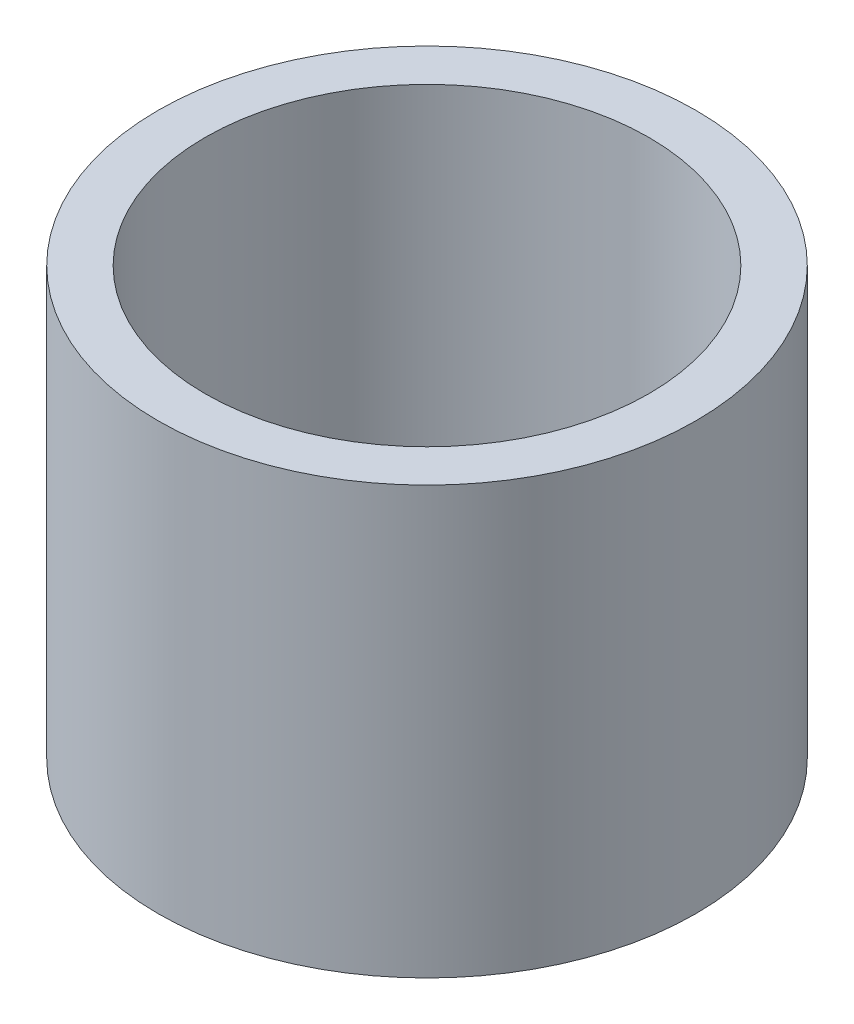
ISO-10303-21;
HEADER;
FILE_DESCRIPTION(('STEP AP214'),'2;1');
FILE_NAME('part.step','',(''),(''),'','','');
FILE_SCHEMA(('AUTOMOTIVE_DESIGN { 1 0 10303 214 1 1 1 1 }'));
ENDSEC;
DATA;
#1=APPLICATION_CONTEXT('core data for automotive mechanical design processes');
#2=APPLICATION_PROTOCOL_DEFINITION('international standard','automotive_design',2000,#1);
#3=PRODUCT_CONTEXT('',#1,'mechanical');
#4=PRODUCT('Part','Part','',(#3));
#5=PRODUCT_RELATED_PRODUCT_CATEGORY('part','',(#4));
#6=PRODUCT_DEFINITION_FORMATION('','',#4);
#7=PRODUCT_DEFINITION_CONTEXT('part definition',#1,'design');
#8=PRODUCT_DEFINITION('design','',#6,#7);
#9=PRODUCT_DEFINITION_SHAPE('','',#8);
#10=(LENGTH_UNIT() NAMED_UNIT(*) SI_UNIT(.MILLI.,.METRE.));
#11=(NAMED_UNIT(*) PLANE_ANGLE_UNIT() SI_UNIT($,.RADIAN.));
#12=(NAMED_UNIT(*) SI_UNIT($,.STERADIAN.) SOLID_ANGLE_UNIT());
#13=UNCERTAINTY_MEASURE_WITH_UNIT(LENGTH_MEASURE(1.E-05),#10,'distance_accuracy_value','');
#14=(GEOMETRIC_REPRESENTATION_CONTEXT(3) GLOBAL_UNCERTAINTY_ASSIGNED_CONTEXT((#13)) GLOBAL_UNIT_ASSIGNED_CONTEXT((#10,
#11,#12)) REPRESENTATION_CONTEXT('',''));
#15=CARTESIAN_POINT('',(0.,0.,0.));
#16=DIRECTION('',(0.,0.,1.));
#17=DIRECTION('',(1.,0.,0.));
#18=AXIS2_PLACEMENT_3D('',#15,#16,#17);
#19=CARTESIAN_POINT('',(0.,20.,0.));
#20=DIRECTION('',(0.,-1.,0.));
#21=DIRECTION('',(0.,0.,-1.));
#22=AXIS2_PLACEMENT_3D('',#19,#20,#21);
#23=CYLINDRICAL_SURFACE('',#22,12.6);
#24=CARTESIAN_POINT('',(0.,20.,0.));
#25=DIRECTION('',(0.,1.,0.));
#26=DIRECTION('',(0.,0.,1.));
#27=AXIS2_PLACEMENT_3D('',#24,#25,#26);
#28=CIRCLE('',#27,12.6);
#29=CARTESIAN_POINT('',(0.,20.,12.6));
#30=VERTEX_POINT('',#29);
#31=EDGE_CURVE('E10',#30,#30,#28,.T.);
#32=ORIENTED_EDGE('',*,*,#31,.F.);
#33=EDGE_LOOP('',(#32));
#34=FACE_BOUND('',#33,.T.);
#35=CARTESIAN_POINT('',(0.,0.,0.));
#36=DIRECTION('',(0.,1.,0.));
#37=DIRECTION('',(0.,0.,1.));
#38=AXIS2_PLACEMENT_3D('',#35,#36,#37);
#39=CIRCLE('',#38,12.6);
#40=CARTESIAN_POINT('',(0.,0.,12.6));
#41=VERTEX_POINT('',#40);
#42=EDGE_CURVE('E40',#41,#41,#39,.T.);
#43=ORIENTED_EDGE('',*,*,#42,.T.);
#44=EDGE_LOOP('',(#43));
#45=FACE_BOUND('',#44,.T.);
#46=ADVANCED_FACE('F37',(#34,#45),#23,.T.);
#47=CARTESIAN_POINT('',(0.,20.,0.));
#48=DIRECTION('',(0.,1.,0.));
#49=DIRECTION('',(0.,0.,1.));
#50=AXIS2_PLACEMENT_3D('',#47,#48,#49);
#51=PLANE('',#50);
#52=CARTESIAN_POINT('',(0.,20.,0.));
#53=DIRECTION('',(0.,1.,0.));
#54=DIRECTION('',(0.,0.,1.));
#55=AXIS2_PLACEMENT_3D('',#52,#53,#54);
#56=CIRCLE('',#55,10.4);
#57=CARTESIAN_POINT('',(0.,20.,10.4));
#58=VERTEX_POINT('',#57);
#59=EDGE_CURVE('E49',#58,#58,#56,.T.);
#60=ORIENTED_EDGE('',*,*,#59,.F.);
#61=EDGE_LOOP('',(#60));
#62=FACE_BOUND('',#61,.T.);
#63=ORIENTED_EDGE('',*,*,#31,.T.);
#64=EDGE_LOOP('',(#63));
#65=FACE_BOUND('',#64,.T.);
#66=ADVANCED_FACE('F62',(#62,#65),#51,.T.);
#67=CARTESIAN_POINT('',(0.,0.,0.));
#68=DIRECTION('',(0.,1.,0.));
#69=DIRECTION('',(0.,0.,1.));
#70=AXIS2_PLACEMENT_3D('',#67,#68,#69);
#71=PLANE('',#70);
#72=CARTESIAN_POINT('',(0.,0.,0.));
#73=DIRECTION('',(0.,1.,0.));
#74=DIRECTION('',(0.,0.,1.));
#75=AXIS2_PLACEMENT_3D('',#72,#73,#74);
#76=CIRCLE('',#75,10.4);
#77=CARTESIAN_POINT('',(0.,0.,10.4));
#78=VERTEX_POINT('',#77);
#79=EDGE_CURVE('E51',#78,#78,#76,.T.);
#80=ORIENTED_EDGE('',*,*,#79,.T.);
#81=EDGE_LOOP('',(#80));
#82=FACE_BOUND('',#81,.T.);
#83=ORIENTED_EDGE('',*,*,#42,.F.);
#84=EDGE_LOOP('',(#83));
#85=FACE_BOUND('',#84,.T.);
#86=ADVANCED_FACE('F64',(#82,#85),#71,.F.);
#87=CARTESIAN_POINT('',(0.,20.,0.));
#88=DIRECTION('',(0.,-1.,0.));
#89=DIRECTION('',(0.,0.,-1.));
#90=AXIS2_PLACEMENT_3D('',#87,#88,#89);
#91=CYLINDRICAL_SURFACE('',#90,10.4);
#92=ORIENTED_EDGE('',*,*,#59,.T.);
#93=EDGE_LOOP('',(#92));
#94=FACE_BOUND('',#93,.T.);
#95=ORIENTED_EDGE('',*,*,#79,.F.);
#96=EDGE_LOOP('',(#95));
#97=FACE_BOUND('',#96,.T.);
#98=ADVANCED_FACE('F59',(#94,#97),#91,.F.);
#99=CLOSED_SHELL('',(#46,#66,#86,#98));
#100=MANIFOLD_SOLID_BREP('B2',#99);
#101=ADVANCED_BREP_SHAPE_REPRESENTATION('',(#18,#100),#14);
#102=SHAPE_DEFINITION_REPRESENTATION(#9,#101);
ENDSEC;
END-ISO-10303-21;
